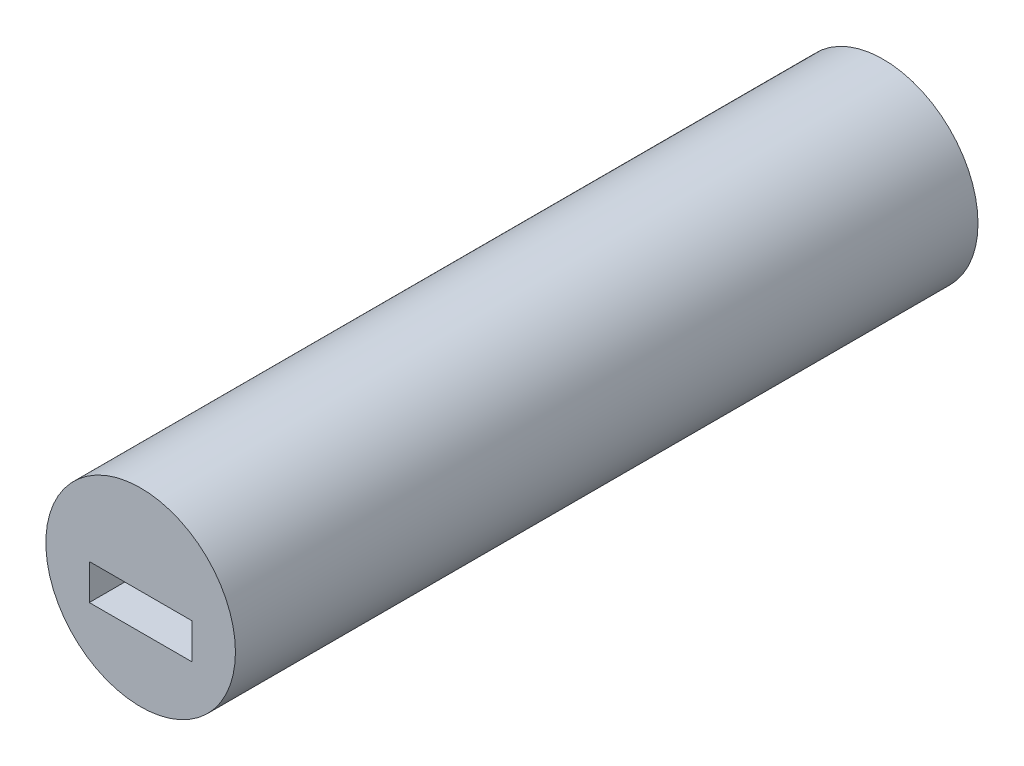
ISO-10303-21;
HEADER;
FILE_DESCRIPTION(('STEP AP214'),'2;1');
FILE_NAME('part.step','',(''),(''),'','','');
FILE_SCHEMA(('AUTOMOTIVE_DESIGN { 1 0 10303 214 1 1 1 1 }'));
ENDSEC;
DATA;
#1=APPLICATION_CONTEXT('core data for automotive mechanical design processes');
#2=APPLICATION_PROTOCOL_DEFINITION('international standard','automotive_design',2000,#1);
#3=PRODUCT_CONTEXT('',#1,'mechanical');
#4=PRODUCT('Part','Part','',(#3));
#5=PRODUCT_RELATED_PRODUCT_CATEGORY('part','',(#4));
#6=PRODUCT_DEFINITION_FORMATION('','',#4);
#7=PRODUCT_DEFINITION_CONTEXT('part definition',#1,'design');
#8=PRODUCT_DEFINITION('design','',#6,#7);
#9=PRODUCT_DEFINITION_SHAPE('','',#8);
#10=(LENGTH_UNIT() NAMED_UNIT(*) SI_UNIT(.MILLI.,.METRE.));
#11=(NAMED_UNIT(*) PLANE_ANGLE_UNIT() SI_UNIT($,.RADIAN.));
#12=(NAMED_UNIT(*) SI_UNIT($,.STERADIAN.) SOLID_ANGLE_UNIT());
#13=UNCERTAINTY_MEASURE_WITH_UNIT(LENGTH_MEASURE(1.E-05),#10,'distance_accuracy_value','');
#14=(GEOMETRIC_REPRESENTATION_CONTEXT(3) GLOBAL_UNCERTAINTY_ASSIGNED_CONTEXT((#13)) GLOBAL_UNIT_ASSIGNED_CONTEXT((#10,
#11,#12)) REPRESENTATION_CONTEXT('',''));
#15=CARTESIAN_POINT('',(0.,0.,0.));
#16=DIRECTION('',(0.,0.,1.));
#17=DIRECTION('',(1.,0.,0.));
#18=AXIS2_PLACEMENT_3D('',#15,#16,#17);
#19=CARTESIAN_POINT('',(0.,0.,69.));
#20=DIRECTION('',(0.,0.,-1.));
#21=DIRECTION('',(-1.,0.,0.));
#22=AXIS2_PLACEMENT_3D('',#19,#20,#21);
#23=CYLINDRICAL_SURFACE('',#22,12.);
#24=CARTESIAN_POINT('',(0.,0.,0.));
#25=DIRECTION('',(0.,0.,1.));
#26=DIRECTION('',(1.,0.,0.));
#27=AXIS2_PLACEMENT_3D('',#24,#25,#26);
#28=CIRCLE('',#27,12.);
#29=CARTESIAN_POINT('',(12.,0.,0.));
#30=VERTEX_POINT('',#29);
#31=EDGE_CURVE('E11',#30,#30,#28,.T.);
#32=ORIENTED_EDGE('',*,*,#31,.T.);
#33=EDGE_LOOP('',(#32));
#34=FACE_BOUND('',#33,.T.);
#35=CARTESIAN_POINT('',(0.,0.,94.));
#36=DIRECTION('',(0.,0.,1.));
#37=DIRECTION('',(1.,0.,0.));
#38=AXIS2_PLACEMENT_3D('',#35,#36,#37);
#39=CIRCLE('',#38,12.);
#40=CARTESIAN_POINT('',(12.,0.,94.));
#41=VERTEX_POINT('',#40);
#42=EDGE_CURVE('E40',#41,#41,#39,.T.);
#43=ORIENTED_EDGE('',*,*,#42,.F.);
#44=EDGE_LOOP('',(#43));
#45=FACE_BOUND('',#44,.T.);
#46=ADVANCED_FACE('F33',(#34,#45),#23,.T.);
#47=CARTESIAN_POINT('',(0.,0.,0.));
#48=DIRECTION('',(0.,0.,1.));
#49=DIRECTION('',(1.,0.,0.));
#50=AXIS2_PLACEMENT_3D('',#47,#48,#49);
#51=PLANE('',#50);
#52=ORIENTED_EDGE('',*,*,#31,.F.);
#53=EDGE_LOOP('',(#52));
#54=FACE_BOUND('',#53,.T.);
#55=ADVANCED_FACE('F112',(#54),#51,.F.);
#56=CARTESIAN_POINT('',(0.,0.,94.));
#57=DIRECTION('',(0.,0.,1.));
#58=DIRECTION('',(1.,0.,0.));
#59=AXIS2_PLACEMENT_3D('',#56,#57,#58);
#60=PLANE('',#59);
#61=ORIENTED_EDGE('',*,*,#42,.T.);
#62=EDGE_LOOP('',(#61));
#63=FACE_BOUND('',#62,.T.);
#64=DIRECTION('',(-1.,0.,0.));
#65=VECTOR('',#64,1.);
#66=CARTESIAN_POINT('',(-6.5,0.684428442877107,94.));
#67=LINE('',#66,#65);
#68=CARTESIAN_POINT('',(6.5,0.684428442877107,94.));
#69=VERTEX_POINT('',#68);
#70=CARTESIAN_POINT('',(-6.5,0.684428442877107,94.));
#71=VERTEX_POINT('',#70);
#72=EDGE_CURVE('E81',#69,#71,#67,.T.);
#73=ORIENTED_EDGE('',*,*,#72,.F.);
#74=DIRECTION('',(0.,1.,0.));
#75=VECTOR('',#74,1.);
#76=CARTESIAN_POINT('',(6.5,0.684428442877107,94.));
#77=LINE('',#76,#75);
#78=CARTESIAN_POINT('',(6.5,-3.81557155712289,94.));
#79=VERTEX_POINT('',#78);
#80=EDGE_CURVE('E72',#79,#69,#77,.T.);
#81=ORIENTED_EDGE('',*,*,#80,.F.);
#82=DIRECTION('',(1.,0.,0.));
#83=VECTOR('',#82,1.);
#84=CARTESIAN_POINT('',(-6.5,-3.81557155712289,94.));
#85=LINE('',#84,#83);
#86=CARTESIAN_POINT('',(-6.5,-3.81557155712289,94.));
#87=VERTEX_POINT('',#86);
#88=EDGE_CURVE('E94',#87,#79,#85,.T.);
#89=ORIENTED_EDGE('',*,*,#88,.F.);
#90=DIRECTION('',(0.,-1.,0.));
#91=VECTOR('',#90,1.);
#92=CARTESIAN_POINT('',(-6.5,0.684428442877107,94.));
#93=LINE('',#92,#91);
#94=EDGE_CURVE('E92',#71,#87,#93,.T.);
#95=ORIENTED_EDGE('',*,*,#94,.F.);
#96=EDGE_LOOP('',(#73,#81,#89,#95));
#97=FACE_BOUND('',#96,.T.);
#98=ADVANCED_FACE('F90',(#63,#97),#60,.T.);
#99=CARTESIAN_POINT('',(6.5,0.684428442877107,94.));
#100=DIRECTION('',(-1.,0.,0.));
#101=DIRECTION('',(0.,0.,1.));
#102=AXIS2_PLACEMENT_3D('',#99,#100,#101);
#103=PLANE('',#102);
#104=DIRECTION('',(0.,1.,0.));
#105=VECTOR('',#104,1.);
#106=CARTESIAN_POINT('',(6.5,0.684428442877107,69.));
#107=LINE('',#106,#105);
#108=CARTESIAN_POINT('',(6.5,-3.81557155712289,69.));
#109=VERTEX_POINT('',#108);
#110=CARTESIAN_POINT('',(6.5,0.684428442877107,69.));
#111=VERTEX_POINT('',#110);
#112=EDGE_CURVE('E47',#109,#111,#107,.T.);
#113=ORIENTED_EDGE('',*,*,#112,.F.);
#114=DIRECTION('',(0.,0.,-1.));
#115=VECTOR('',#114,1.);
#116=CARTESIAN_POINT('',(6.5,-3.81557155712289,94.));
#117=LINE('',#116,#115);
#118=EDGE_CURVE('E77',#79,#109,#117,.T.);
#119=ORIENTED_EDGE('',*,*,#118,.F.);
#120=ORIENTED_EDGE('',*,*,#80,.T.);
#121=DIRECTION('',(0.,0.,-1.));
#122=VECTOR('',#121,1.);
#123=CARTESIAN_POINT('',(6.5,0.684428442877107,94.));
#124=LINE('',#123,#122);
#125=EDGE_CURVE('E75',#69,#111,#124,.T.);
#126=ORIENTED_EDGE('',*,*,#125,.T.);
#127=EDGE_LOOP('',(#113,#119,#120,#126));
#128=FACE_BOUND('',#127,.T.);
#129=ADVANCED_FACE('F74',(#128),#103,.T.);
#130=CARTESIAN_POINT('',(-6.5,0.684428442877107,94.));
#131=DIRECTION('',(0.,-1.,0.));
#132=DIRECTION('',(0.,0.,-1.));
#133=AXIS2_PLACEMENT_3D('',#130,#131,#132);
#134=PLANE('',#133);
#135=DIRECTION('',(-1.,0.,0.));
#136=VECTOR('',#135,1.);
#137=CARTESIAN_POINT('',(-6.5,0.684428442877107,69.));
#138=LINE('',#137,#136);
#139=CARTESIAN_POINT('',(-6.5,0.684428442877107,69.));
#140=VERTEX_POINT('',#139);
#141=EDGE_CURVE('E51',#111,#140,#138,.T.);
#142=ORIENTED_EDGE('',*,*,#141,.F.);
#143=ORIENTED_EDGE('',*,*,#125,.F.);
#144=ORIENTED_EDGE('',*,*,#72,.T.);
#145=DIRECTION('',(0.,0.,-1.));
#146=VECTOR('',#145,1.);
#147=CARTESIAN_POINT('',(-6.5,0.684428442877107,94.));
#148=LINE('',#147,#146);
#149=EDGE_CURVE('E87',#71,#140,#148,.T.);
#150=ORIENTED_EDGE('',*,*,#149,.T.);
#151=EDGE_LOOP('',(#142,#143,#144,#150));
#152=FACE_BOUND('',#151,.T.);
#153=ADVANCED_FACE('F85',(#152),#134,.T.);
#154=CARTESIAN_POINT('',(-6.5,0.684428442877107,94.));
#155=DIRECTION('',(1.,0.,0.));
#156=DIRECTION('',(0.,0.,-1.));
#157=AXIS2_PLACEMENT_3D('',#154,#155,#156);
#158=PLANE('',#157);
#159=DIRECTION('',(0.,-1.,0.));
#160=VECTOR('',#159,1.);
#161=CARTESIAN_POINT('',(-6.5,0.684428442877107,69.));
#162=LINE('',#161,#160);
#163=CARTESIAN_POINT('',(-6.5,-3.81557155712289,69.));
#164=VERTEX_POINT('',#163);
#165=EDGE_CURVE('E100',#140,#164,#162,.T.);
#166=ORIENTED_EDGE('',*,*,#165,.F.);
#167=ORIENTED_EDGE('',*,*,#149,.F.);
#168=ORIENTED_EDGE('',*,*,#94,.T.);
#169=DIRECTION('',(0.,0.,-1.));
#170=VECTOR('',#169,1.);
#171=CARTESIAN_POINT('',(-6.5,-3.81557155712289,94.));
#172=LINE('',#171,#170);
#173=EDGE_CURVE('E104',#87,#164,#172,.T.);
#174=ORIENTED_EDGE('',*,*,#173,.T.);
#175=EDGE_LOOP('',(#166,#167,#168,#174));
#176=FACE_BOUND('',#175,.T.);
#177=ADVANCED_FACE('F132',(#176),#158,.T.);
#178=CARTESIAN_POINT('',(-6.5,-3.81557155712289,94.));
#179=DIRECTION('',(0.,1.,0.));
#180=DIRECTION('',(0.,0.,1.));
#181=AXIS2_PLACEMENT_3D('',#178,#179,#180);
#182=PLANE('',#181);
#183=DIRECTION('',(1.,0.,0.));
#184=VECTOR('',#183,1.);
#185=CARTESIAN_POINT('',(-6.5,-3.81557155712289,69.));
#186=LINE('',#185,#184);
#187=EDGE_CURVE('E82',#164,#109,#186,.T.);
#188=ORIENTED_EDGE('',*,*,#187,.F.);
#189=ORIENTED_EDGE('',*,*,#173,.F.);
#190=ORIENTED_EDGE('',*,*,#88,.T.);
#191=ORIENTED_EDGE('',*,*,#118,.T.);
#192=EDGE_LOOP('',(#188,#189,#190,#191));
#193=FACE_BOUND('',#192,.T.);
#194=ADVANCED_FACE('F126',(#193),#182,.T.);
#195=CARTESIAN_POINT('',(0.,0.,69.));
#196=DIRECTION('',(0.,0.,1.));
#197=DIRECTION('',(1.,0.,0.));
#198=AXIS2_PLACEMENT_3D('',#195,#196,#197);
#199=PLANE('',#198);
#200=ORIENTED_EDGE('',*,*,#112,.T.);
#201=ORIENTED_EDGE('',*,*,#141,.T.);
#202=ORIENTED_EDGE('',*,*,#165,.T.);
#203=ORIENTED_EDGE('',*,*,#187,.T.);
#204=EDGE_LOOP('',(#200,#201,#202,#203));
#205=FACE_BOUND('',#204,.T.);
#206=ADVANCED_FACE('F124',(#205),#199,.T.);
#207=CLOSED_SHELL('',(#46,#55,#98,#129,#153,#177,#194,#206));
#208=MANIFOLD_SOLID_BREP('B2',#207);
#209=ADVANCED_BREP_SHAPE_REPRESENTATION('',(#18,#208),#14);
#210=SHAPE_DEFINITION_REPRESENTATION(#9,#209);
ENDSEC;
END-ISO-10303-21;
